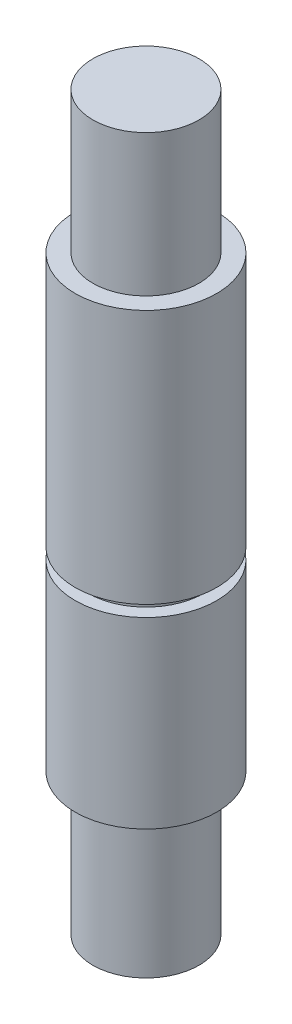
ISO-10303-21;
HEADER;
FILE_DESCRIPTION(('STEP AP214'),'2;1');
FILE_NAME('part.step','',(''),(''),'','','');
FILE_SCHEMA(('AUTOMOTIVE_DESIGN { 1 0 10303 214 1 1 1 1 }'));
ENDSEC;
DATA;
#1=APPLICATION_CONTEXT('core data for automotive mechanical design processes');
#2=APPLICATION_PROTOCOL_DEFINITION('international standard','automotive_design',2000,#1);
#3=PRODUCT_CONTEXT('',#1,'mechanical');
#4=PRODUCT('Part','Part','',(#3));
#5=PRODUCT_RELATED_PRODUCT_CATEGORY('part','',(#4));
#6=PRODUCT_DEFINITION_FORMATION('','',#4);
#7=PRODUCT_DEFINITION_CONTEXT('part definition',#1,'design');
#8=PRODUCT_DEFINITION('design','',#6,#7);
#9=PRODUCT_DEFINITION_SHAPE('','',#8);
#10=(LENGTH_UNIT() NAMED_UNIT(*) SI_UNIT(.MILLI.,.METRE.));
#11=(NAMED_UNIT(*) PLANE_ANGLE_UNIT() SI_UNIT($,.RADIAN.));
#12=(NAMED_UNIT(*) SI_UNIT($,.STERADIAN.) SOLID_ANGLE_UNIT());
#13=UNCERTAINTY_MEASURE_WITH_UNIT(LENGTH_MEASURE(1.E-05),#10,'distance_accuracy_value','');
#14=(GEOMETRIC_REPRESENTATION_CONTEXT(3) GLOBAL_UNCERTAINTY_ASSIGNED_CONTEXT((#13)) GLOBAL_UNIT_ASSIGNED_CONTEXT((#10,
#11,#12)) REPRESENTATION_CONTEXT('',''));
#15=CARTESIAN_POINT('',(0.,0.,0.));
#16=DIRECTION('',(0.,0.,1.));
#17=DIRECTION('',(1.,0.,0.));
#18=AXIS2_PLACEMENT_3D('',#15,#16,#17);
#19=CARTESIAN_POINT('',(0.,83.5,0.));
#20=DIRECTION('',(0.,-1.,0.));
#21=DIRECTION('',(0.,0.,-1.));
#22=AXIS2_PLACEMENT_3D('',#19,#20,#21);
#23=CYLINDRICAL_SURFACE('',#22,10.);
#24=CARTESIAN_POINT('',(0.,83.5,0.));
#25=DIRECTION('',(0.,1.,0.));
#26=DIRECTION('',(0.,0.,1.));
#27=AXIS2_PLACEMENT_3D('',#24,#25,#26);
#28=CIRCLE('',#27,10.);
#29=CARTESIAN_POINT('',(0.,83.5,10.));
#30=VERTEX_POINT('',#29);
#31=EDGE_CURVE('E140',#30,#30,#28,.T.);
#32=ORIENTED_EDGE('',*,*,#31,.F.);
#33=EDGE_LOOP('',(#32));
#34=FACE_BOUND('',#33,.T.);
#35=DIRECTION('',(0.,-1.,0.));
#36=VECTOR('',#35,1.);
#37=CARTESIAN_POINT('',(-5.,83.5,-8.66025403784439));
#38=LINE('',#37,#36);
#39=CARTESIAN_POINT('',(-5.,55.5,-8.66025403784439));
#40=VERTEX_POINT('',#39);
#41=CARTESIAN_POINT('',(-5.,75.5,-8.66025403784439));
#42=VERTEX_POINT('',#41);
#43=EDGE_CURVE('E11',#40,#42,#38,.F.);
#44=ORIENTED_EDGE('',*,*,#43,.F.);
#45=CARTESIAN_POINT('',(-4.99999999999999,55.5,-8.66025403784439));
#46=CARTESIAN_POINT('',(-5.00002361400665,55.3690551405764,-8.66021552033594));
#47=CARTESIAN_POINT('',(-4.99485685536709,55.2381316657651,-8.66322292251226));
#48=CARTESIAN_POINT('',(-4.97432835463361,54.977428194996,-8.67503956566087));
#49=CARTESIAN_POINT('',(-4.95897287636425,54.8476475460919,-8.68384524194288));
#50=CARTESIAN_POINT('',(-4.91836897696975,54.5909049450771,-8.70690282410304));
#51=CARTESIAN_POINT('',(-4.89317776130509,54.4639311009609,-8.72112322585304));
#52=CARTESIAN_POINT('',(-4.83323443039698,54.2129447349329,-8.75448565934704));
#53=CARTESIAN_POINT('',(-4.79848121695518,54.0889325549482,-8.77362825639015));
#54=CARTESIAN_POINT('',(-4.68059421874925,53.723072210014,-8.83742418586505));
#55=CARTESIAN_POINT('',(-4.58370758179872,53.4866236346289,-8.888521608378));
#56=CARTESIAN_POINT('',(-4.35652191689124,53.03316463674,-9.00204283953054));
#57=CARTESIAN_POINT('',(-4.22617111722961,52.8161850425903,-9.06448415391184));
#58=CARTESIAN_POINT('',(-3.92332753303753,52.3884638777806,-9.1998483217762));
#59=CARTESIAN_POINT('',(-3.74825998454395,52.1796839550238,-9.27321075223625));
#60=CARTESIAN_POINT('',(-3.36618253064711,51.7928906513023,-9.41862456793029));
#61=CARTESIAN_POINT('',(-3.15916398787608,51.6148856174366,-9.49067559274421));
#62=CARTESIAN_POINT('',(-2.82033262665918,51.3687739780084,-9.5948442553227));
#63=CARTESIAN_POINT('',(-2.69838307186012,51.2880876086397,-9.62993521302806));
#64=CARTESIAN_POINT('',(-2.44722349262974,51.1373725726557,-9.6968010119373));
#65=CARTESIAN_POINT('',(-2.31801637346258,51.067339682412,-9.72857716573444));
#66=CARTESIAN_POINT('',(-2.05317650766719,50.9386249163095,-9.78789466782769));
#67=CARTESIAN_POINT('',(-1.91754538302573,50.8799401939902,-9.8154370777172));
#68=CARTESIAN_POINT('',(-1.64079804248705,50.7745693390513,-9.86547225261225));
#69=CARTESIAN_POINT('',(-1.49968241150578,50.7278819309532,-9.88796555437483));
#70=CARTESIAN_POINT('',(-1.22330545331383,50.6499847939096,-9.92580345064965));
#71=CARTESIAN_POINT('',(-1.08834157921129,50.6179104146062,-9.94154270016939));
#72=CARTESIAN_POINT('',(-0.815713669527527,50.5650343440945,-9.96761533354204));
#73=CARTESIAN_POINT('',(-0.678049898223188,50.5442315552275,-9.97794924377854));
#74=CARTESIAN_POINT('',(-0.401222745023757,50.514180514881,-9.99290878928165));
#75=CARTESIAN_POINT('',(-0.262060093114589,50.5049268744857,-9.99753708681581));
#76=CARTESIAN_POINT('',(0.0166197568526225,50.4980856271868,-10.0009568325234));
#77=CARTESIAN_POINT('',(0.156136932700891,50.5004973066602,-9.99974863774267));
#78=CARTESIAN_POINT('',(0.422159500792041,50.5162306747243,-9.99189259522169));
#79=CARTESIAN_POINT('',(0.548737988934724,50.5285820069976,-9.98572860401049));
#80=CARTESIAN_POINT('',(0.800317143215526,50.5628333184562,-9.96872078084596));
#81=CARTESIAN_POINT('',(0.925317298329881,50.5847363125856,-9.95787547126404));
#82=CARTESIAN_POINT('',(1.17280949958549,50.6378476715496,-9.93176665601097));
#83=CARTESIAN_POINT('',(1.29530241634484,50.6690527456551,-9.91650471283579));
#84=CARTESIAN_POINT('',(1.53706975958874,50.7404484208242,-9.88192118125886));
#85=CARTESIAN_POINT('',(1.65634293372147,50.7806424633709,-9.86259803817218));
#86=CARTESIAN_POINT('',(2.0114016406576,50.9153738718986,-9.79859254190634));
#87=CARTESIAN_POINT('',(2.24122379760985,51.0233673603779,-9.74822697051344));
#88=CARTESIAN_POINT('',(2.6799208370611,51.2713276136025,-9.63687905561348));
#89=CARTESIAN_POINT('',(2.88878786915032,51.4113062970588,-9.57589275650222));
#90=CARTESIAN_POINT('',(3.30083676660026,51.7344525594972,-9.44222809770673));
#91=CARTESIAN_POINT('',(3.50161847625699,51.920450581563,-9.36898946989683));
#92=CARTESIAN_POINT('',(3.8705258927301,52.3229609760052,-9.22271533381489));
#93=CARTESIAN_POINT('',(4.03862220150569,52.5395005189574,-9.14968006610293));
#94=CARTESIAN_POINT('',(4.26800936304422,52.8912787088491,-9.04388357914142));
#95=CARTESIAN_POINT('',(4.34250455921231,53.0172266281896,-9.00825027478857));
#96=CARTESIAN_POINT('',(4.48048286606627,53.2758749331907,-8.94042357322577));
#97=CARTESIAN_POINT('',(4.54397081915908,53.4085723161648,-8.90822866577079));
#98=CARTESIAN_POINT('',(4.65920157527322,53.6796994257693,-8.84850577092728));
#99=CARTESIAN_POINT('',(4.71096553526111,53.8181182847965,-8.82096939990701));
#100=CARTESIAN_POINT('',(4.80224062914383,54.0998517889756,-8.77161166383332));
#101=CARTESIAN_POINT('',(4.84175707215304,54.2431642828167,-8.74978782312349));
#102=CARTESIAN_POINT('',(4.91615453273693,54.5694891718365,-8.70825525914846));
#103=CARTESIAN_POINT('',(4.94749058408946,54.7535780295348,-8.69039463239673));
#104=CARTESIAN_POINT('',(4.97893750965506,55.0320693939718,-8.67238767476004));
#105=CARTESIAN_POINT('',(4.98682704102584,55.1253908618574,-8.66784921973964));
#106=CARTESIAN_POINT('',(4.99736013738331,55.3124646853443,-8.66177877348575));
#107=CARTESIAN_POINT('',(5.00000155752501,55.4062172014276,-8.66024801146594));
#108=CARTESIAN_POINT('',(5.,55.5,-8.66025403784439));
#109=B_SPLINE_CURVE_WITH_KNOTS('',3,(#45,#46,#47,#48,#49,#50,#51,#52,#53,#54,#55,#56,#57,#58,
#59,#60,#61,#62,#63,#64,#65,#66,#67,#68,#69,#70,#71,#72,#73,#74,#75,#76,#77,#78,#79,#80,#81,#82,
#83,#84,#85,#86,#87,#88,#89,#90,#91,#92,#93,#94,#95,#96,#97,#98,#99,#100,#101,#102,#103,#104,
#105,#106,#107,#108),.UNSPECIFIED.,.F.,.F.,(4,2,2,2,2,2,2,2,2,2,2,2,2,2,2,2,2,2,2,2,2,2,2,2,2,2,
2,2,2,2,2,4),(0.,0.392663111074223,0.785085043976624,1.17525782500548,1.56547543621649,
2.34356953597109,3.12287474023973,3.96591805439185,4.80918967038283,5.25982775608521,
5.71028671567882,6.16063253969345,6.6109304659631,7.02920191619561,7.4474326266662,
7.86546811463039,8.28347802970752,8.66501292889444,9.04666834532886,9.42818890621362,
9.80985578547375,10.5829611793111,11.3563551282125,12.2027949390745,13.0499925721764,
13.5013153935383,13.9524391582349,14.4027422267378,14.8528498217362,15.4139318158641,
15.695056461108,15.9762959752701),.UNSPECIFIED.);
#110=CARTESIAN_POINT('',(5.,55.5,-8.66025403784439));
#111=VERTEX_POINT('',#110);
#112=EDGE_CURVE('E138',#40,#111,#109,.T.);
#113=ORIENTED_EDGE('',*,*,#112,.T.);
#114=DIRECTION('',(0.,-1.,0.));
#115=VECTOR('',#114,1.);
#116=CARTESIAN_POINT('',(4.99999999999999,83.5,-8.66025403784439));
#117=LINE('',#116,#115);
#118=CARTESIAN_POINT('',(4.99999999999999,75.5,-8.66025403784439));
#119=VERTEX_POINT('',#118);
#120=EDGE_CURVE('E52',#111,#119,#117,.F.);
#121=ORIENTED_EDGE('',*,*,#120,.T.);
#122=CARTESIAN_POINT('',(5.,75.5,-8.66025403784439));
#123=CARTESIAN_POINT('',(5.00002361400665,75.6309448594236,-8.66021552033594));
#124=CARTESIAN_POINT('',(4.9948568553671,75.7618683342349,-8.66322292251226));
#125=CARTESIAN_POINT('',(4.97432835463361,76.022571805004,-8.67503956566086));
#126=CARTESIAN_POINT('',(4.95897287636426,76.1523524539081,-8.68384524194288));
#127=CARTESIAN_POINT('',(4.91836897696976,76.4090950549229,-8.70690282410304));
#128=CARTESIAN_POINT('',(4.8931777613051,76.5360688990391,-8.72112322585303));
#129=CARTESIAN_POINT('',(4.833234430397,76.7870552650671,-8.75448565934703));
#130=CARTESIAN_POINT('',(4.79848121695519,76.9110674450518,-8.77362825639014));
#131=CARTESIAN_POINT('',(4.68059421874926,77.276927789986,-8.83742418586504));
#132=CARTESIAN_POINT('',(4.58370758179873,77.5133763653711,-8.88852160837799));
#133=CARTESIAN_POINT('',(4.35652191689126,77.96683536326,-9.00204283953053));
#134=CARTESIAN_POINT('',(4.22617111722963,78.1838149574097,-9.06448415391183));
#135=CARTESIAN_POINT('',(3.92332753303754,78.6115361222194,-9.19984832177619));
#136=CARTESIAN_POINT('',(3.74825998454396,78.8203160449762,-9.27321075223624));
#137=CARTESIAN_POINT('',(3.36618253064712,79.2071093486977,-9.41862456793028));
#138=CARTESIAN_POINT('',(3.1591639878761,79.3851143825634,-9.49067559274421));
#139=CARTESIAN_POINT('',(2.82033262665921,79.6312260219916,-9.59484425532269));
#140=CARTESIAN_POINT('',(2.69838307186015,79.7119123913603,-9.62993521302805));
#141=CARTESIAN_POINT('',(2.44722349262977,79.8626274273443,-9.69680101193729));
#142=CARTESIAN_POINT('',(2.31801637346261,79.932660317588,-9.72857716573444));
#143=CARTESIAN_POINT('',(2.05317650766723,80.0613750836906,-9.78789466782768));
#144=CARTESIAN_POINT('',(1.91754538302576,80.1200598060098,-9.81543707771719));
#145=CARTESIAN_POINT('',(1.64079804248709,80.2254306609487,-9.86547225261224));
#146=CARTESIAN_POINT('',(1.49968241150582,80.2721180690468,-9.88796555437483));
#147=CARTESIAN_POINT('',(1.22330545331386,80.3500152060904,-9.92580345064965));
#148=CARTESIAN_POINT('',(1.08834157921133,80.3820895853938,-9.94154270016938));
#149=CARTESIAN_POINT('',(0.815713669527563,80.4349656559055,-9.96761533354203));
#150=CARTESIAN_POINT('',(0.678049898223225,80.4557684447725,-9.97794924377854));
#151=CARTESIAN_POINT('',(0.401222745023795,80.4858194851191,-9.99290878928164));
#152=CARTESIAN_POINT('',(0.262060093114626,80.4950731255143,-9.99753708681581));
#153=CARTESIAN_POINT('',(-0.016619756852586,80.5019143728132,-10.0009568325234));
#154=CARTESIAN_POINT('',(-0.156136932700855,80.4995026933398,-9.99974863774267));
#155=CARTESIAN_POINT('',(-0.422159500792005,80.4837693252757,-9.99189259522169));
#156=CARTESIAN_POINT('',(-0.548737988934689,80.4714179930024,-9.98572860401049));
#157=CARTESIAN_POINT('',(-0.800317143215492,80.4371666815438,-9.96872078084596));
#158=CARTESIAN_POINT('',(-0.925317298329847,80.4152636874145,-9.95787547126404));
#159=CARTESIAN_POINT('',(-1.17280949958546,80.3621523284504,-9.93176665601098));
#160=CARTESIAN_POINT('',(-1.29530241634481,80.3309472543449,-9.91650471283579));
#161=CARTESIAN_POINT('',(-1.53706975958871,80.2595515791759,-9.88192118125886));
#162=CARTESIAN_POINT('',(-1.65634293372144,80.2193575366291,-9.86259803817219));
#163=CARTESIAN_POINT('',(-2.01140164065757,80.0846261281014,-9.79859254190635));
#164=CARTESIAN_POINT('',(-2.24122379760982,79.9766326396221,-9.74822697051344));
#165=CARTESIAN_POINT('',(-2.67992083706107,79.7286723863975,-9.63687905561349));
#166=CARTESIAN_POINT('',(-2.88878786915029,79.5886937029412,-9.57589275650222));
#167=CARTESIAN_POINT('',(-3.30083676660023,79.2655474405028,-9.44222809770674));
#168=CARTESIAN_POINT('',(-3.50161847625697,79.0795494184371,-9.36898946989683));
#169=CARTESIAN_POINT('',(-3.87052589273008,78.6770390239948,-9.22271533381489));
#170=CARTESIAN_POINT('',(-4.03862220150567,78.4604994810427,-9.14968006610294));
#171=CARTESIAN_POINT('',(-4.2680093630442,78.1087212911509,-9.04388357914143));
#172=CARTESIAN_POINT('',(-4.34250455921229,77.9827733718104,-9.00825027478858));
#173=CARTESIAN_POINT('',(-4.48048286606625,77.7241250668093,-8.94042357322578));
#174=CARTESIAN_POINT('',(-4.54397081915906,77.5914276838352,-8.9082286657708));
#175=CARTESIAN_POINT('',(-4.6592015752732,77.3203005742307,-8.84850577092729));
#176=CARTESIAN_POINT('',(-4.71096553526109,77.1818817152035,-8.82096939990702));
#177=CARTESIAN_POINT('',(-4.80224062914382,76.9001482110245,-8.77161166383333));
#178=CARTESIAN_POINT('',(-4.84175707215303,76.7568357171834,-8.74978782312349));
#179=CARTESIAN_POINT('',(-4.91615453273692,76.4305108281635,-8.70825525914847));
#180=CARTESIAN_POINT('',(-4.94749058408945,76.2464219704652,-8.69039463239674));
#181=CARTESIAN_POINT('',(-4.97893750965505,75.9679306060282,-8.67238767476004));
#182=CARTESIAN_POINT('',(-4.98682704102584,75.8746091381426,-8.66784921973964));
#183=CARTESIAN_POINT('',(-4.99736013738331,75.6875353146557,-8.66177877348576));
#184=CARTESIAN_POINT('',(-5.00000155752501,75.5937827985724,-8.66024801146594));
#185=CARTESIAN_POINT('',(-4.99999999999999,75.5,-8.66025403784439));
#186=B_SPLINE_CURVE_WITH_KNOTS('',3,(#122,#123,#124,#125,#126,#127,#128,#129,#130,#131,#132,
#133,#134,#135,#136,#137,#138,#139,#140,#141,#142,#143,#144,#145,#146,#147,#148,#149,#150,#151,
#152,#153,#154,#155,#156,#157,#158,#159,#160,#161,#162,#163,#164,#165,#166,#167,#168,#169,#170,
#171,#172,#173,#174,#175,#176,#177,#178,#179,#180,#181,#182,#183,#184,#185),.UNSPECIFIED.,.F.,
.F.,(4,2,2,2,2,2,2,2,2,2,2,2,2,2,2,2,2,2,2,2,2,2,2,2,2,2,2,2,2,2,2,4),(0.,0.392663111074216,
0.785085043976617,1.17525782500544,1.56547543621648,2.34356953597108,3.12287474023971,
3.96591805439184,4.80918967038282,5.25982775608519,5.71028671567881,6.16063253969342,
6.61093046596307,7.02920191619559,7.44743262666618,7.86546811463037,8.2834780297075,
8.66501292889442,9.04666834532885,9.42818890621361,9.80985578547373,10.5829611793111,
11.3563551282125,12.2027949390745,13.0499925721764,13.5013153935383,13.9524391582349,
14.4027422267378,14.8528498217362,15.413931815864,15.695056461108,15.9762959752701),.UNSPECIFIED.);
#187=EDGE_CURVE('E67',#119,#42,#186,.T.);
#188=ORIENTED_EDGE('',*,*,#187,.T.);
#189=EDGE_LOOP('',(#44,#113,#121,#188));
#190=FACE_BOUND('',#189,.T.);
#191=CARTESIAN_POINT('',(0.,47.5,0.));
#192=DIRECTION('',(0.,1.,0.));
#193=DIRECTION('',(0.,0.,1.));
#194=AXIS2_PLACEMENT_3D('',#191,#192,#193);
#195=CIRCLE('',#194,10.);
#196=CARTESIAN_POINT('',(0.,47.5,10.));
#197=VERTEX_POINT('',#196);
#198=EDGE_CURVE('E107',#197,#197,#195,.T.);
#199=ORIENTED_EDGE('',*,*,#198,.T.);
#200=EDGE_LOOP('',(#199));
#201=FACE_BOUND('',#200,.T.);
#202=ADVANCED_FACE('F43',(#34,#190,#201),#23,.T.);
#203=CARTESIAN_POINT('',(0.,83.5,0.));
#204=DIRECTION('',(0.,1.,0.));
#205=DIRECTION('',(0.,0.,1.));
#206=AXIS2_PLACEMENT_3D('',#203,#204,#205);
#207=PLANE('',#206);
#208=CARTESIAN_POINT('',(0.,83.5,0.));
#209=DIRECTION('',(0.,1.,0.));
#210=DIRECTION('',(0.,0.,1.));
#211=AXIS2_PLACEMENT_3D('',#208,#209,#210);
#212=CIRCLE('',#211,7.5);
#213=CARTESIAN_POINT('',(0.,83.5,7.5));
#214=VERTEX_POINT('',#213);
#215=EDGE_CURVE('E134',#214,#214,#212,.T.);
#216=ORIENTED_EDGE('',*,*,#215,.F.);
#217=EDGE_LOOP('',(#216));
#218=FACE_BOUND('',#217,.T.);
#219=ORIENTED_EDGE('',*,*,#31,.T.);
#220=EDGE_LOOP('',(#219));
#221=FACE_BOUND('',#220,.T.);
#222=ADVANCED_FACE('F184',(#218,#221),#207,.T.);
#223=CARTESIAN_POINT('',(0.,103.5,0.));
#224=DIRECTION('',(0.,-1.,0.));
#225=DIRECTION('',(0.,0.,-1.));
#226=AXIS2_PLACEMENT_3D('',#223,#224,#225);
#227=CYLINDRICAL_SURFACE('',#226,7.5);
#228=CARTESIAN_POINT('',(0.,103.5,0.));
#229=DIRECTION('',(0.,1.,0.));
#230=DIRECTION('',(0.,0.,1.));
#231=AXIS2_PLACEMENT_3D('',#228,#229,#230);
#232=CIRCLE('',#231,7.5);
#233=CARTESIAN_POINT('',(0.,103.5,7.5));
#234=VERTEX_POINT('',#233);
#235=EDGE_CURVE('E124',#234,#234,#232,.T.);
#236=ORIENTED_EDGE('',*,*,#235,.F.);
#237=EDGE_LOOP('',(#236));
#238=FACE_BOUND('',#237,.T.);
#239=ORIENTED_EDGE('',*,*,#215,.T.);
#240=EDGE_LOOP('',(#239));
#241=FACE_BOUND('',#240,.T.);
#242=ADVANCED_FACE('F180',(#238,#241),#227,.T.);
#243=CARTESIAN_POINT('',(0.,103.5,0.));
#244=DIRECTION('',(0.,1.,0.));
#245=DIRECTION('',(0.,0.,1.));
#246=AXIS2_PLACEMENT_3D('',#243,#244,#245);
#247=PLANE('',#246);
#248=ORIENTED_EDGE('',*,*,#235,.T.);
#249=EDGE_LOOP('',(#248));
#250=FACE_BOUND('',#249,.T.);
#251=ADVANCED_FACE('F177',(#250),#247,.T.);
#252=CARTESIAN_POINT('',(4.99999999999999,0.,-4.));
#253=DIRECTION('',(1.,0.,0.));
#254=DIRECTION('',(0.,1.,0.));
#255=AXIS2_PLACEMENT_3D('',#252,#253,#254);
#256=PLANE('',#255);
#257=DIRECTION('',(0.,0.,-1.));
#258=VECTOR('',#257,1.);
#259=CARTESIAN_POINT('',(4.99999999999999,55.5,-4.));
#260=LINE('',#259,#258);
#261=CARTESIAN_POINT('',(4.99999999999999,55.5,-4.));
#262=VERTEX_POINT('',#261);
#263=EDGE_CURVE('E59',#262,#111,#260,.T.);
#264=ORIENTED_EDGE('',*,*,#263,.F.);
#265=DIRECTION('',(0.,-1.,0.));
#266=VECTOR('',#265,1.);
#267=CARTESIAN_POINT('',(4.99999999999999,0.,-4.));
#268=LINE('',#267,#266);
#269=CARTESIAN_POINT('',(4.99999999999999,75.5,-4.));
#270=VERTEX_POINT('',#269);
#271=EDGE_CURVE('E86',#270,#262,#268,.T.);
#272=ORIENTED_EDGE('',*,*,#271,.F.);
#273=DIRECTION('',(0.,0.,-1.));
#274=VECTOR('',#273,1.);
#275=CARTESIAN_POINT('',(4.99999999999999,75.5,-4.));
#276=LINE('',#275,#274);
#277=EDGE_CURVE('E121',#270,#119,#276,.T.);
#278=ORIENTED_EDGE('',*,*,#277,.T.);
#279=ORIENTED_EDGE('',*,*,#120,.F.);
#280=EDGE_LOOP('',(#264,#272,#278,#279));
#281=FACE_BOUND('',#280,.T.);
#282=ADVANCED_FACE('F84',(#281),#256,.F.);
#283=CARTESIAN_POINT('',(0.,75.5,-4.));
#284=DIRECTION('',(0.,0.,-1.));
#285=DIRECTION('',(-1.,0.,0.));
#286=AXIS2_PLACEMENT_3D('',#283,#284,#285);
#287=CYLINDRICAL_SURFACE('',#286,4.99999999999999);
#288=ORIENTED_EDGE('',*,*,#277,.F.);
#289=CARTESIAN_POINT('',(0.,75.5,-4.));
#290=DIRECTION('',(0.,0.,-1.));
#291=DIRECTION('',(-1.,0.,0.));
#292=AXIS2_PLACEMENT_3D('',#289,#290,#291);
#293=CIRCLE('',#292,4.99999999999999);
#294=CARTESIAN_POINT('',(-5.,75.5,-4.));
#295=VERTEX_POINT('',#294);
#296=EDGE_CURVE('E92',#295,#270,#293,.T.);
#297=ORIENTED_EDGE('',*,*,#296,.F.);
#298=DIRECTION('',(0.,0.,-1.));
#299=VECTOR('',#298,1.);
#300=CARTESIAN_POINT('',(-5.,75.5,-4.));
#301=LINE('',#300,#299);
#302=EDGE_CURVE('E125',#295,#42,#301,.T.);
#303=ORIENTED_EDGE('',*,*,#302,.T.);
#304=ORIENTED_EDGE('',*,*,#187,.F.);
#305=EDGE_LOOP('',(#288,#297,#303,#304));
#306=FACE_BOUND('',#305,.T.);
#307=ADVANCED_FACE('F176',(#306),#287,.F.);
#308=CARTESIAN_POINT('',(-5.,0.,-4.));
#309=DIRECTION('',(1.,0.,0.));
#310=DIRECTION('',(0.,1.,0.));
#311=AXIS2_PLACEMENT_3D('',#308,#309,#310);
#312=PLANE('',#311);
#313=ORIENTED_EDGE('',*,*,#43,.T.);
#314=ORIENTED_EDGE('',*,*,#302,.F.);
#315=DIRECTION('',(0.,-1.,0.));
#316=VECTOR('',#315,1.);
#317=CARTESIAN_POINT('',(-5.,0.,-4.));
#318=LINE('',#317,#316);
#319=CARTESIAN_POINT('',(-5.,55.5,-4.));
#320=VERTEX_POINT('',#319);
#321=EDGE_CURVE('E102',#295,#320,#318,.T.);
#322=ORIENTED_EDGE('',*,*,#321,.T.);
#323=DIRECTION('',(0.,0.,-1.));
#324=VECTOR('',#323,1.);
#325=CARTESIAN_POINT('',(-5.,55.5,-4.));
#326=LINE('',#325,#324);
#327=EDGE_CURVE('E91',#320,#40,#326,.T.);
#328=ORIENTED_EDGE('',*,*,#327,.T.);
#329=EDGE_LOOP('',(#313,#314,#322,#328));
#330=FACE_BOUND('',#329,.T.);
#331=ADVANCED_FACE('F173',(#330),#312,.T.);
#332=CARTESIAN_POINT('',(0.,55.5,-4.));
#333=DIRECTION('',(0.,0.,-1.));
#334=DIRECTION('',(-1.,0.,0.));
#335=AXIS2_PLACEMENT_3D('',#332,#333,#334);
#336=CYLINDRICAL_SURFACE('',#335,4.99999999999999);
#337=ORIENTED_EDGE('',*,*,#327,.F.);
#338=CARTESIAN_POINT('',(0.,55.5,-4.));
#339=DIRECTION('',(0.,0.,-1.));
#340=DIRECTION('',(-1.,0.,0.));
#341=AXIS2_PLACEMENT_3D('',#338,#339,#340);
#342=CIRCLE('',#341,4.99999999999999);
#343=EDGE_CURVE('E96',#262,#320,#342,.T.);
#344=ORIENTED_EDGE('',*,*,#343,.F.);
#345=ORIENTED_EDGE('',*,*,#263,.T.);
#346=ORIENTED_EDGE('',*,*,#112,.F.);
#347=EDGE_LOOP('',(#337,#344,#345,#346));
#348=FACE_BOUND('',#347,.T.);
#349=ADVANCED_FACE('F97',(#348),#336,.F.);
#350=CARTESIAN_POINT('',(0.,0.,-4.));
#351=DIRECTION('',(0.,0.,-1.));
#352=DIRECTION('',(-1.,0.,0.));
#353=AXIS2_PLACEMENT_3D('',#350,#351,#352);
#354=PLANE('',#353);
#355=ORIENTED_EDGE('',*,*,#271,.T.);
#356=ORIENTED_EDGE('',*,*,#343,.T.);
#357=ORIENTED_EDGE('',*,*,#321,.F.);
#358=ORIENTED_EDGE('',*,*,#296,.T.);
#359=EDGE_LOOP('',(#355,#356,#357,#358));
#360=FACE_BOUND('',#359,.T.);
#361=ADVANCED_FACE('F104',(#360),#354,.T.);
#362=CARTESIAN_POINT('',(0.,47.5,-10.));
#363=DIRECTION('',(0.,-1.,0.));
#364=DIRECTION('',(0.,0.,-1.));
#365=AXIS2_PLACEMENT_3D('',#362,#363,#364);
#366=PLANE('',#365);
#367=CARTESIAN_POINT('',(0.,47.5,0.));
#368=DIRECTION('',(0.,1.,0.));
#369=DIRECTION('',(0.,0.,1.));
#370=AXIS2_PLACEMENT_3D('',#367,#368,#369);
#371=CIRCLE('',#370,8.2);
#372=CARTESIAN_POINT('',(0.,47.5,8.2));
#373=VERTEX_POINT('',#372);
#374=EDGE_CURVE('E113',#373,#373,#371,.T.);
#375=ORIENTED_EDGE('',*,*,#374,.T.);
#376=EDGE_LOOP('',(#375));
#377=FACE_BOUND('',#376,.T.);
#378=ORIENTED_EDGE('',*,*,#198,.F.);
#379=EDGE_LOOP('',(#378));
#380=FACE_BOUND('',#379,.T.);
#381=ADVANCED_FACE('F210',(#377,#380),#366,.T.);
#382=CARTESIAN_POINT('',(0.,103.034047476855,0.));
#383=DIRECTION('',(0.,1.,0.));
#384=DIRECTION('',(0.,0.,1.));
#385=AXIS2_PLACEMENT_3D('',#382,#383,#384);
#386=CYLINDRICAL_SURFACE('',#385,8.2);
#387=CARTESIAN_POINT('',(0.,45.9,0.));
#388=DIRECTION('',(0.,1.,0.));
#389=DIRECTION('',(0.,0.,1.));
#390=AXIS2_PLACEMENT_3D('',#387,#388,#389);
#391=CIRCLE('',#390,8.2);
#392=CARTESIAN_POINT('',(0.,45.9,8.2));
#393=VERTEX_POINT('',#392);
#394=EDGE_CURVE('E270',#393,#393,#391,.T.);
#395=ORIENTED_EDGE('',*,*,#394,.T.);
#396=EDGE_LOOP('',(#395));
#397=FACE_BOUND('',#396,.T.);
#398=ORIENTED_EDGE('',*,*,#374,.F.);
#399=EDGE_LOOP('',(#398));
#400=FACE_BOUND('',#399,.T.);
#401=ADVANCED_FACE('F212',(#397,#400),#386,.T.);
#402=CARTESIAN_POINT('',(0.,45.9,-8.2));
#403=DIRECTION('',(0.,1.,0.));
#404=DIRECTION('',(0.,0.,1.));
#405=AXIS2_PLACEMENT_3D('',#402,#403,#404);
#406=PLANE('',#405);
#407=CARTESIAN_POINT('',(0.,45.9,0.));
#408=DIRECTION('',(0.,1.,0.));
#409=DIRECTION('',(0.,0.,1.));
#410=AXIS2_PLACEMENT_3D('',#407,#408,#409);
#411=CIRCLE('',#410,10.);
#412=CARTESIAN_POINT('',(0.,45.9,10.));
#413=VERTEX_POINT('',#412);
#414=EDGE_CURVE('E275',#413,#413,#411,.T.);
#415=ORIENTED_EDGE('',*,*,#414,.T.);
#416=EDGE_LOOP('',(#415));
#417=FACE_BOUND('',#416,.T.);
#418=ORIENTED_EDGE('',*,*,#394,.F.);
#419=EDGE_LOOP('',(#418));
#420=FACE_BOUND('',#419,.T.);
#421=ADVANCED_FACE('F219',(#417,#420),#406,.T.);
#422=CARTESIAN_POINT('',(0.,0.,0.));
#423=DIRECTION('',(0.,1.,0.));
#424=DIRECTION('',(0.,0.,1.));
#425=AXIS2_PLACEMENT_3D('',#422,#423,#424);
#426=PLANE('',#425);
#427=CARTESIAN_POINT('',(0.,0.,0.));
#428=DIRECTION('',(0.,1.,0.));
#429=DIRECTION('',(0.,0.,1.));
#430=AXIS2_PLACEMENT_3D('',#427,#428,#429);
#431=CIRCLE('',#430,7.5);
#432=CARTESIAN_POINT('',(0.,0.,7.5));
#433=VERTEX_POINT('',#432);
#434=EDGE_CURVE('E144',#433,#433,#431,.T.);
#435=ORIENTED_EDGE('',*,*,#434,.F.);
#436=EDGE_LOOP('',(#435));
#437=FACE_BOUND('',#436,.T.);
#438=ADVANCED_FACE('F197',(#437),#426,.F.);
#439=CARTESIAN_POINT('',(0.,20.,0.));
#440=DIRECTION('',(0.,-1.,0.));
#441=DIRECTION('',(0.,0.,-1.));
#442=AXIS2_PLACEMENT_3D('',#439,#440,#441);
#443=CYLINDRICAL_SURFACE('',#442,7.5);
#444=CARTESIAN_POINT('',(0.,20.,0.));
#445=DIRECTION('',(0.,1.,0.));
#446=DIRECTION('',(0.,0.,1.));
#447=AXIS2_PLACEMENT_3D('',#444,#445,#446);
#448=CIRCLE('',#447,7.5);
#449=CARTESIAN_POINT('',(0.,20.,7.5));
#450=VERTEX_POINT('',#449);
#451=EDGE_CURVE('E139',#450,#450,#448,.T.);
#452=ORIENTED_EDGE('',*,*,#451,.F.);
#453=EDGE_LOOP('',(#452));
#454=FACE_BOUND('',#453,.T.);
#455=ORIENTED_EDGE('',*,*,#434,.T.);
#456=EDGE_LOOP('',(#455));
#457=FACE_BOUND('',#456,.T.);
#458=ADVANCED_FACE('F45',(#454,#457),#443,.T.);
#459=CARTESIAN_POINT('',(0.,20.,0.));
#460=DIRECTION('',(0.,1.,0.));
#461=DIRECTION('',(0.,0.,1.));
#462=AXIS2_PLACEMENT_3D('',#459,#460,#461);
#463=PLANE('',#462);
#464=ORIENTED_EDGE('',*,*,#451,.T.);
#465=EDGE_LOOP('',(#464));
#466=FACE_BOUND('',#465,.T.);
#467=CARTESIAN_POINT('',(0.,20.,0.));
#468=DIRECTION('',(0.,1.,0.));
#469=DIRECTION('',(0.,0.,1.));
#470=AXIS2_PLACEMENT_3D('',#467,#468,#469);
#471=CIRCLE('',#470,10.);
#472=CARTESIAN_POINT('',(0.,20.,10.));
#473=VERTEX_POINT('',#472);
#474=EDGE_CURVE('E133',#473,#473,#471,.T.);
#475=ORIENTED_EDGE('',*,*,#474,.F.);
#476=EDGE_LOOP('',(#475));
#477=FACE_BOUND('',#476,.T.);
#478=ADVANCED_FACE('F188',(#466,#477),#463,.F.);
#479=ORIENTED_EDGE('',*,*,#474,.T.);
#480=EDGE_LOOP('',(#479));
#481=FACE_BOUND('',#480,.T.);
#482=ORIENTED_EDGE('',*,*,#414,.F.);
#483=EDGE_LOOP('',(#482));
#484=FACE_BOUND('',#483,.T.);
#485=ADVANCED_FACE('F190',(#481,#484),#23,.T.);
#486=CLOSED_SHELL('',(#202,#222,#242,#251,#282,#307,#331,#349,#361,#381,#401,#421,#438,#458,
#478,#485));
#487=MANIFOLD_SOLID_BREP('B2',#486);
#488=ADVANCED_BREP_SHAPE_REPRESENTATION('',(#18,#487),#14);
#489=SHAPE_DEFINITION_REPRESENTATION(#9,#488);
ENDSEC;
END-ISO-10303-21;
